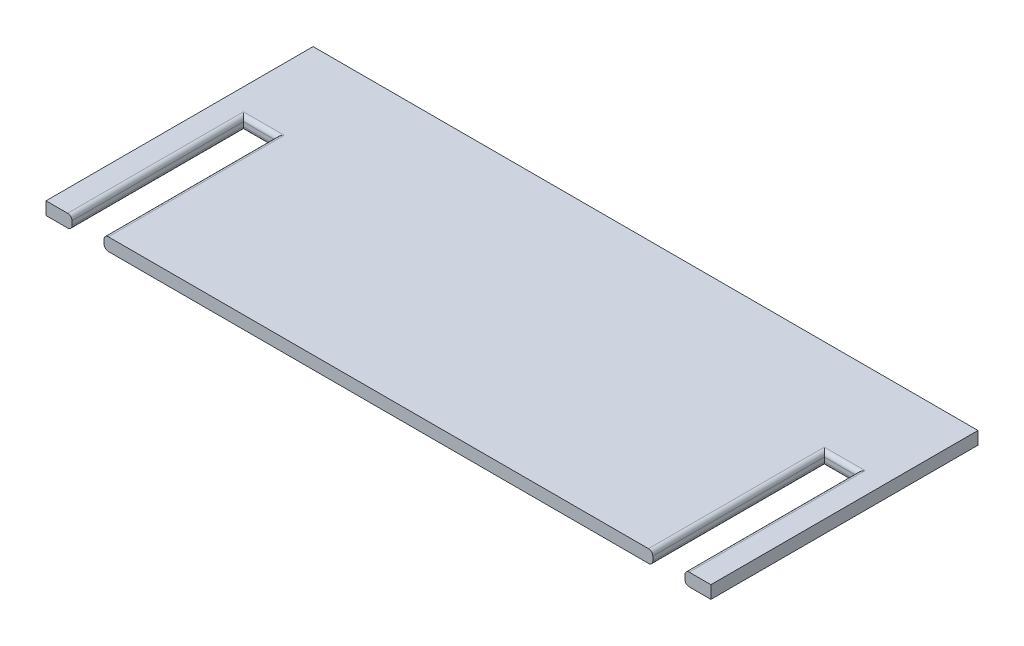
ISO-10303-21;
HEADER;
FILE_DESCRIPTION(('STEP AP214'),'2;1');
FILE_NAME('part.step','',(''),(''),'','','');
FILE_SCHEMA(('AUTOMOTIVE_DESIGN { 1 0 10303 214 1 1 1 1 }'));
ENDSEC;
DATA;
#1=APPLICATION_CONTEXT('core data for automotive mechanical design processes');
#2=APPLICATION_PROTOCOL_DEFINITION('international standard','automotive_design',2000,#1);
#3=PRODUCT_CONTEXT('',#1,'mechanical');
#4=PRODUCT('Part','Part','',(#3));
#5=PRODUCT_RELATED_PRODUCT_CATEGORY('part','',(#4));
#6=PRODUCT_DEFINITION_FORMATION('','',#4);
#7=PRODUCT_DEFINITION_CONTEXT('part definition',#1,'design');
#8=PRODUCT_DEFINITION('design','',#6,#7);
#9=PRODUCT_DEFINITION_SHAPE('','',#8);
#10=(LENGTH_UNIT() NAMED_UNIT(*) SI_UNIT(.MILLI.,.METRE.));
#11=(NAMED_UNIT(*) PLANE_ANGLE_UNIT() SI_UNIT($,.RADIAN.));
#12=(NAMED_UNIT(*) SI_UNIT($,.STERADIAN.) SOLID_ANGLE_UNIT());
#13=UNCERTAINTY_MEASURE_WITH_UNIT(LENGTH_MEASURE(1.E-05),#10,'distance_accuracy_value','');
#14=(GEOMETRIC_REPRESENTATION_CONTEXT(3) GLOBAL_UNCERTAINTY_ASSIGNED_CONTEXT((#13)) GLOBAL_UNIT_ASSIGNED_CONTEXT((#10,
#11,#12)) REPRESENTATION_CONTEXT('',''));
#15=CARTESIAN_POINT('',(0.,0.,0.));
#16=DIRECTION('',(0.,0.,1.));
#17=DIRECTION('',(1.,0.,0.));
#18=AXIS2_PLACEMENT_3D('',#15,#16,#17);
#19=CARTESIAN_POINT('',(155.03,1.49,31.14));
#20=DIRECTION('',(0.,0.,-1.));
#21=DIRECTION('',(-1.,0.,0.));
#22=AXIS2_PLACEMENT_3D('',#19,#20,#21);
#23=PLANE('',#22);
#24=DIRECTION('',(-1.,0.,0.));
#25=VECTOR('',#24,1.);
#26=CARTESIAN_POINT('',(155.03,-1.49,31.14));
#27=LINE('',#26,#25);
#28=CARTESIAN_POINT('',(140.484740143394,-1.49,31.14));
#29=VERTEX_POINT('',#28);
#30=CARTESIAN_POINT('',(14.5452598566057,-1.49,31.14));
#31=VERTEX_POINT('',#30);
#32=EDGE_CURVE('E206',#29,#31,#27,.T.);
#33=ORIENTED_EDGE('',*,*,#32,.F.);
#34=CARTESIAN_POINT('',(140.484740143394,-0.49,31.14));
#35=DIRECTION('',(0.,0.,-1.));
#36=DIRECTION('',(-1.,0.,0.));
#37=AXIS2_PLACEMENT_3D('',#34,#35,#36);
#38=CIRCLE('',#37,1.);
#39=CARTESIAN_POINT('',(141.484740143394,-0.49,31.14));
#40=VERTEX_POINT('',#39);
#41=EDGE_CURVE('E302',#29,#40,#38,.F.);
#42=ORIENTED_EDGE('',*,*,#41,.T.);
#43=DIRECTION('',(0.,1.,0.));
#44=VECTOR('',#43,1.);
#45=CARTESIAN_POINT('',(141.484740143394,-1.49,31.14));
#46=LINE('',#45,#44);
#47=CARTESIAN_POINT('',(141.484740143394,0.49,31.14));
#48=VERTEX_POINT('',#47);
#49=EDGE_CURVE('E249',#40,#48,#46,.T.);
#50=ORIENTED_EDGE('',*,*,#49,.T.);
#51=CARTESIAN_POINT('',(140.484740143394,0.49,31.14));
#52=DIRECTION('',(0.,0.,-1.));
#53=DIRECTION('',(-1.,0.,0.));
#54=AXIS2_PLACEMENT_3D('',#51,#52,#53);
#55=CIRCLE('',#54,1.);
#56=CARTESIAN_POINT('',(140.484740143394,1.49,31.14));
#57=VERTEX_POINT('',#56);
#58=EDGE_CURVE('E300',#48,#57,#55,.F.);
#59=ORIENTED_EDGE('',*,*,#58,.T.);
#60=DIRECTION('',(-1.,0.,0.));
#61=VECTOR('',#60,1.);
#62=CARTESIAN_POINT('',(155.03,1.49,31.14));
#63=LINE('',#62,#61);
#64=CARTESIAN_POINT('',(14.5452598566057,1.49,31.14));
#65=VERTEX_POINT('',#64);
#66=EDGE_CURVE('E223',#57,#65,#63,.T.);
#67=ORIENTED_EDGE('',*,*,#66,.T.);
#68=CARTESIAN_POINT('',(14.5452598566057,0.49,31.14));
#69=DIRECTION('',(0.,0.,-1.));
#70=DIRECTION('',(-1.,0.,0.));
#71=AXIS2_PLACEMENT_3D('',#68,#69,#70);
#72=CIRCLE('',#71,1.);
#73=CARTESIAN_POINT('',(13.5452598566057,0.49,31.14));
#74=VERTEX_POINT('',#73);
#75=EDGE_CURVE('E349',#65,#74,#72,.F.);
#76=ORIENTED_EDGE('',*,*,#75,.T.);
#77=DIRECTION('',(0.,1.,0.));
#78=VECTOR('',#77,1.);
#79=CARTESIAN_POINT('',(13.5452598566057,-1.49,31.14));
#80=LINE('',#79,#78);
#81=CARTESIAN_POINT('',(13.5452598566057,-0.49,31.14));
#82=VERTEX_POINT('',#81);
#83=EDGE_CURVE('E234',#82,#74,#80,.T.);
#84=ORIENTED_EDGE('',*,*,#83,.F.);
#85=CARTESIAN_POINT('',(14.5452598566057,-0.49,31.14));
#86=DIRECTION('',(0.,0.,-1.));
#87=DIRECTION('',(-1.,0.,0.));
#88=AXIS2_PLACEMENT_3D('',#85,#86,#87);
#89=CIRCLE('',#88,1.);
#90=EDGE_CURVE('E344',#82,#31,#89,.F.);
#91=ORIENTED_EDGE('',*,*,#90,.T.);
#92=EDGE_LOOP('',(#33,#42,#50,#59,#67,#76,#84,#91));
#93=FACE_BOUND('',#92,.T.);
#94=ADVANCED_FACE('F41',(#93),#23,.F.);
#95=DIRECTION('',(0.,1.,0.));
#96=VECTOR('',#95,1.);
#97=CARTESIAN_POINT('',(148.984740143394,-1.49,31.14));
#98=LINE('',#97,#96);
#99=CARTESIAN_POINT('',(148.984740143394,-0.49,31.14));
#100=VERTEX_POINT('',#99);
#101=CARTESIAN_POINT('',(148.984740143394,0.49,31.14));
#102=VERTEX_POINT('',#101);
#103=EDGE_CURVE('E252',#100,#102,#98,.T.);
#104=ORIENTED_EDGE('',*,*,#103,.F.);
#105=CARTESIAN_POINT('',(149.984740143394,-0.49,31.14));
#106=DIRECTION('',(0.,0.,-1.));
#107=DIRECTION('',(-1.,0.,0.));
#108=AXIS2_PLACEMENT_3D('',#105,#106,#107);
#109=CIRCLE('',#108,1.);
#110=CARTESIAN_POINT('',(149.984740143394,-1.49,31.14));
#111=VERTEX_POINT('',#110);
#112=EDGE_CURVE('E204',#100,#111,#109,.F.);
#113=ORIENTED_EDGE('',*,*,#112,.T.);
#114=CARTESIAN_POINT('',(155.03,-1.49,31.14));
#115=VERTEX_POINT('',#114);
#116=EDGE_CURVE('E184',#115,#111,#27,.T.);
#117=ORIENTED_EDGE('',*,*,#116,.F.);
#118=DIRECTION('',(0.,-1.,0.));
#119=VECTOR('',#118,1.);
#120=CARTESIAN_POINT('',(155.03,1.49,31.14));
#121=LINE('',#120,#119);
#122=CARTESIAN_POINT('',(155.03,1.49,31.14));
#123=VERTEX_POINT('',#122);
#124=EDGE_CURVE('E191',#123,#115,#121,.T.);
#125=ORIENTED_EDGE('',*,*,#124,.F.);
#126=CARTESIAN_POINT('',(149.984740143394,1.49,31.14));
#127=VERTEX_POINT('',#126);
#128=EDGE_CURVE('E219',#123,#127,#63,.T.);
#129=ORIENTED_EDGE('',*,*,#128,.T.);
#130=CARTESIAN_POINT('',(149.984740143394,0.49,31.14));
#131=DIRECTION('',(0.,0.,-1.));
#132=DIRECTION('',(-1.,0.,0.));
#133=AXIS2_PLACEMENT_3D('',#130,#131,#132);
#134=CIRCLE('',#133,1.);
#135=EDGE_CURVE('E283',#127,#102,#134,.F.);
#136=ORIENTED_EDGE('',*,*,#135,.T.);
#137=EDGE_LOOP('',(#104,#113,#117,#125,#129,#136));
#138=FACE_BOUND('',#137,.T.);
#139=ADVANCED_FACE('F203',(#138),#23,.F.);
#140=CARTESIAN_POINT('',(155.03,-1.49,31.14));
#141=DIRECTION('',(0.,1.,0.));
#142=DIRECTION('',(0.,0.,1.));
#143=AXIS2_PLACEMENT_3D('',#140,#141,#142);
#144=PLANE('',#143);
#145=ORIENTED_EDGE('',*,*,#116,.T.);
#146=DIRECTION('',(0.,0.,1.));
#147=VECTOR('',#146,1.);
#148=CARTESIAN_POINT('',(149.984740143394,-1.49,-8.86));
#149=LINE('',#148,#147);
#150=CARTESIAN_POINT('',(149.984740143394,-1.49,-9.86));
#151=VERTEX_POINT('',#150);
#152=EDGE_CURVE('E290',#111,#151,#149,.F.);
#153=ORIENTED_EDGE('',*,*,#152,.T.);
#154=DIRECTION('',(1.,0.,0.));
#155=VECTOR('',#154,1.);
#156=CARTESIAN_POINT('',(141.484740143394,-1.49,-9.86));
#157=LINE('',#156,#155);
#158=CARTESIAN_POINT('',(140.484740143394,-1.49,-9.86));
#159=VERTEX_POINT('',#158);
#160=EDGE_CURVE('E288',#151,#159,#157,.F.);
#161=ORIENTED_EDGE('',*,*,#160,.T.);
#162=DIRECTION('',(0.,0.,-1.));
#163=VECTOR('',#162,1.);
#164=CARTESIAN_POINT('',(140.484740143394,-1.49,31.14));
#165=LINE('',#164,#163);
#166=EDGE_CURVE('E286',#159,#29,#165,.F.);
#167=ORIENTED_EDGE('',*,*,#166,.T.);
#168=ORIENTED_EDGE('',*,*,#32,.T.);
#169=DIRECTION('',(0.,0.,-1.));
#170=VECTOR('',#169,1.);
#171=CARTESIAN_POINT('',(14.5452598566057,-1.49,31.14));
#172=LINE('',#171,#170);
#173=CARTESIAN_POINT('',(14.5452598566057,-1.49,-9.86));
#174=VERTEX_POINT('',#173);
#175=EDGE_CURVE('E205',#31,#174,#172,.T.);
#176=ORIENTED_EDGE('',*,*,#175,.T.);
#177=DIRECTION('',(-1.,0.,0.));
#178=VECTOR('',#177,1.);
#179=CARTESIAN_POINT('',(155.03,-1.49,-9.86));
#180=LINE('',#179,#178);
#181=CARTESIAN_POINT('',(5.04525985660567,-1.49,-9.86));
#182=VERTEX_POINT('',#181);
#183=EDGE_CURVE('E209',#174,#182,#180,.T.);
#184=ORIENTED_EDGE('',*,*,#183,.T.);
#185=DIRECTION('',(0.,0.,1.));
#186=VECTOR('',#185,1.);
#187=CARTESIAN_POINT('',(5.04525985660567,-1.49,31.14));
#188=LINE('',#187,#186);
#189=CARTESIAN_POINT('',(5.04525985660567,-1.49,31.14));
#190=VERTEX_POINT('',#189);
#191=EDGE_CURVE('E357',#182,#190,#188,.T.);
#192=ORIENTED_EDGE('',*,*,#191,.T.);
#193=CARTESIAN_POINT('',(0.,-1.49,31.14));
#194=VERTEX_POINT('',#193);
#195=EDGE_CURVE('E208',#190,#194,#27,.T.);
#196=ORIENTED_EDGE('',*,*,#195,.T.);
#197=DIRECTION('',(0.,0.,-1.));
#198=VECTOR('',#197,1.);
#199=CARTESIAN_POINT('',(0.,-1.49,31.14));
#200=LINE('',#199,#198);
#201=CARTESIAN_POINT('',(0.,-1.49,-31.14));
#202=VERTEX_POINT('',#201);
#203=EDGE_CURVE('E229',#194,#202,#200,.T.);
#204=ORIENTED_EDGE('',*,*,#203,.T.);
#205=DIRECTION('',(-1.,0.,0.));
#206=VECTOR('',#205,1.);
#207=CARTESIAN_POINT('',(155.03,-1.49,-31.14));
#208=LINE('',#207,#206);
#209=CARTESIAN_POINT('',(155.03,-1.49,-31.14));
#210=VERTEX_POINT('',#209);
#211=EDGE_CURVE('E187',#210,#202,#208,.T.);
#212=ORIENTED_EDGE('',*,*,#211,.F.);
#213=DIRECTION('',(0.,0.,-1.));
#214=VECTOR('',#213,1.);
#215=CARTESIAN_POINT('',(155.03,-1.49,31.14));
#216=LINE('',#215,#214);
#217=EDGE_CURVE('E180',#115,#210,#216,.T.);
#218=ORIENTED_EDGE('',*,*,#217,.F.);
#219=EDGE_LOOP('',(#145,#153,#161,#167,#168,#176,#184,#192,#196,#204,#212,#218));
#220=FACE_BOUND('',#219,.T.);
#221=ADVANCED_FACE('F182',(#220),#144,.F.);
#222=CARTESIAN_POINT('',(155.03,1.49,31.14));
#223=DIRECTION('',(0.,-1.,0.));
#224=DIRECTION('',(0.,0.,-1.));
#225=AXIS2_PLACEMENT_3D('',#222,#223,#224);
#226=PLANE('',#225);
#227=ORIENTED_EDGE('',*,*,#66,.F.);
#228=DIRECTION('',(0.,0.,-1.));
#229=VECTOR('',#228,1.);
#230=CARTESIAN_POINT('',(140.484740143394,1.49,-8.86));
#231=LINE('',#230,#229);
#232=CARTESIAN_POINT('',(140.484740143394,1.49,-9.86));
#233=VERTEX_POINT('',#232);
#234=EDGE_CURVE('E11',#57,#233,#231,.T.);
#235=ORIENTED_EDGE('',*,*,#234,.T.);
#236=DIRECTION('',(1.,0.,0.));
#237=VECTOR('',#236,1.);
#238=CARTESIAN_POINT('',(148.984740143394,1.49,-9.86));
#239=LINE('',#238,#237);
#240=CARTESIAN_POINT('',(149.984740143394,1.49,-9.86));
#241=VERTEX_POINT('',#240);
#242=EDGE_CURVE('E50',#233,#241,#239,.T.);
#243=ORIENTED_EDGE('',*,*,#242,.T.);
#244=DIRECTION('',(0.,0.,1.));
#245=VECTOR('',#244,1.);
#246=CARTESIAN_POINT('',(149.984740143394,1.49,31.14));
#247=LINE('',#246,#245);
#248=EDGE_CURVE('E304',#241,#127,#247,.T.);
#249=ORIENTED_EDGE('',*,*,#248,.T.);
#250=ORIENTED_EDGE('',*,*,#128,.F.);
#251=DIRECTION('',(0.,0.,1.));
#252=VECTOR('',#251,1.);
#253=CARTESIAN_POINT('',(155.03,1.49,31.14));
#254=LINE('',#253,#252);
#255=CARTESIAN_POINT('',(155.03,1.49,-31.14));
#256=VERTEX_POINT('',#255);
#257=EDGE_CURVE('E196',#256,#123,#254,.T.);
#258=ORIENTED_EDGE('',*,*,#257,.F.);
#259=DIRECTION('',(-1.,0.,0.));
#260=VECTOR('',#259,1.);
#261=CARTESIAN_POINT('',(155.03,1.49,-31.14));
#262=LINE('',#261,#260);
#263=CARTESIAN_POINT('',(0.,1.49,-31.14));
#264=VERTEX_POINT('',#263);
#265=EDGE_CURVE('E215',#256,#264,#262,.T.);
#266=ORIENTED_EDGE('',*,*,#265,.T.);
#267=DIRECTION('',(0.,0.,1.));
#268=VECTOR('',#267,1.);
#269=CARTESIAN_POINT('',(0.,1.49,31.14));
#270=LINE('',#269,#268);
#271=CARTESIAN_POINT('',(0.,1.49,31.14));
#272=VERTEX_POINT('',#271);
#273=EDGE_CURVE('E200',#264,#272,#270,.T.);
#274=ORIENTED_EDGE('',*,*,#273,.T.);
#275=CARTESIAN_POINT('',(5.04525985660567,1.49,31.14));
#276=VERTEX_POINT('',#275);
#277=EDGE_CURVE('E224',#276,#272,#63,.T.);
#278=ORIENTED_EDGE('',*,*,#277,.F.);
#279=DIRECTION('',(0.,0.,1.));
#280=VECTOR('',#279,1.);
#281=CARTESIAN_POINT('',(5.04525985660567,1.49,31.14));
#282=LINE('',#281,#280);
#283=CARTESIAN_POINT('',(5.04525985660568,1.49,-9.86));
#284=VERTEX_POINT('',#283);
#285=EDGE_CURVE('E348',#276,#284,#282,.F.);
#286=ORIENTED_EDGE('',*,*,#285,.T.);
#287=DIRECTION('',(-1.,0.,0.));
#288=VECTOR('',#287,1.);
#289=CARTESIAN_POINT('',(155.03,1.49,-9.86));
#290=LINE('',#289,#288);
#291=CARTESIAN_POINT('',(14.5452598566057,1.49,-9.86));
#292=VERTEX_POINT('',#291);
#293=EDGE_CURVE('E387',#284,#292,#290,.F.);
#294=ORIENTED_EDGE('',*,*,#293,.T.);
#295=DIRECTION('',(0.,0.,-1.));
#296=VECTOR('',#295,1.);
#297=CARTESIAN_POINT('',(14.5452598566057,1.49,31.14));
#298=LINE('',#297,#296);
#299=EDGE_CURVE('E280',#292,#65,#298,.F.);
#300=ORIENTED_EDGE('',*,*,#299,.T.);
#301=EDGE_LOOP('',(#227,#235,#243,#249,#250,#258,#266,#274,#278,#286,#294,#300));
#302=FACE_BOUND('',#301,.T.);
#303=ADVANCED_FACE('F320',(#302),#226,.F.);
#304=ORIENTED_EDGE('',*,*,#195,.F.);
#305=CARTESIAN_POINT('',(5.04525985660567,-0.49,31.14));
#306=DIRECTION('',(0.,0.,-1.));
#307=DIRECTION('',(-1.,0.,0.));
#308=AXIS2_PLACEMENT_3D('',#305,#306,#307);
#309=CIRCLE('',#308,1.);
#310=CARTESIAN_POINT('',(6.04525985660568,-0.49,31.14));
#311=VERTEX_POINT('',#310);
#312=EDGE_CURVE('E367',#190,#311,#309,.F.);
#313=ORIENTED_EDGE('',*,*,#312,.T.);
#314=DIRECTION('',(0.,1.,0.));
#315=VECTOR('',#314,1.);
#316=CARTESIAN_POINT('',(6.04525985660568,-1.49,31.14));
#317=LINE('',#316,#315);
#318=CARTESIAN_POINT('',(6.04525985660568,0.49,31.14));
#319=VERTEX_POINT('',#318);
#320=EDGE_CURVE('E244',#311,#319,#317,.T.);
#321=ORIENTED_EDGE('',*,*,#320,.T.);
#322=CARTESIAN_POINT('',(5.04525985660568,0.49,31.14));
#323=DIRECTION('',(0.,0.,-1.));
#324=DIRECTION('',(-1.,0.,0.));
#325=AXIS2_PLACEMENT_3D('',#322,#323,#324);
#326=CIRCLE('',#325,1.);
#327=EDGE_CURVE('E368',#319,#276,#326,.F.);
#328=ORIENTED_EDGE('',*,*,#327,.T.);
#329=ORIENTED_EDGE('',*,*,#277,.T.);
#330=DIRECTION('',(0.,-1.,0.));
#331=VECTOR('',#330,1.);
#332=CARTESIAN_POINT('',(0.,1.49,31.14));
#333=LINE('',#332,#331);
#334=EDGE_CURVE('E231',#272,#194,#333,.T.);
#335=ORIENTED_EDGE('',*,*,#334,.T.);
#336=EDGE_LOOP('',(#304,#313,#321,#328,#329,#335));
#337=FACE_BOUND('',#336,.T.);
#338=ADVANCED_FACE('F421',(#337),#23,.F.);
#339=CARTESIAN_POINT('',(155.03,1.49,-31.14));
#340=DIRECTION('',(0.,0.,1.));
#341=DIRECTION('',(1.,0.,0.));
#342=AXIS2_PLACEMENT_3D('',#339,#340,#341);
#343=PLANE('',#342);
#344=DIRECTION('',(0.,1.,0.));
#345=VECTOR('',#344,1.);
#346=CARTESIAN_POINT('',(0.,1.49,-31.14));
#347=LINE('',#346,#345);
#348=EDGE_CURVE('E227',#202,#264,#347,.T.);
#349=ORIENTED_EDGE('',*,*,#348,.T.);
#350=ORIENTED_EDGE('',*,*,#265,.F.);
#351=DIRECTION('',(0.,1.,0.));
#352=VECTOR('',#351,1.);
#353=CARTESIAN_POINT('',(155.03,1.49,-31.14));
#354=LINE('',#353,#352);
#355=EDGE_CURVE('E190',#210,#256,#354,.T.);
#356=ORIENTED_EDGE('',*,*,#355,.F.);
#357=ORIENTED_EDGE('',*,*,#211,.T.);
#358=EDGE_LOOP('',(#349,#350,#356,#357));
#359=FACE_BOUND('',#358,.T.);
#360=ADVANCED_FACE('F428',(#359),#343,.F.);
#361=CARTESIAN_POINT('',(155.03,0.,0.));
#362=DIRECTION('',(1.,0.,0.));
#363=DIRECTION('',(0.,0.,-1.));
#364=AXIS2_PLACEMENT_3D('',#361,#362,#363);
#365=PLANE('',#364);
#366=ORIENTED_EDGE('',*,*,#124,.T.);
#367=ORIENTED_EDGE('',*,*,#217,.T.);
#368=ORIENTED_EDGE('',*,*,#355,.T.);
#369=ORIENTED_EDGE('',*,*,#257,.T.);
#370=EDGE_LOOP('',(#366,#367,#368,#369));
#371=FACE_BOUND('',#370,.T.);
#372=ADVANCED_FACE('F194',(#371),#365,.T.);
#373=CARTESIAN_POINT('',(0.,0.,0.));
#374=DIRECTION('',(1.,0.,0.));
#375=DIRECTION('',(0.,0.,-1.));
#376=AXIS2_PLACEMENT_3D('',#373,#374,#375);
#377=PLANE('',#376);
#378=ORIENTED_EDGE('',*,*,#334,.F.);
#379=ORIENTED_EDGE('',*,*,#273,.F.);
#380=ORIENTED_EDGE('',*,*,#348,.F.);
#381=ORIENTED_EDGE('',*,*,#203,.F.);
#382=EDGE_LOOP('',(#378,#379,#380,#381));
#383=FACE_BOUND('',#382,.T.);
#384=ADVANCED_FACE('F442',(#383),#377,.F.);
#385=CARTESIAN_POINT('',(13.5452598566057,-1.49,31.14));
#386=DIRECTION('',(1.,0.,0.));
#387=DIRECTION('',(0.,0.,-1.));
#388=AXIS2_PLACEMENT_3D('',#385,#386,#387);
#389=PLANE('',#388);
#390=DIRECTION('',(0.,1.,0.));
#391=VECTOR('',#390,1.);
#392=CARTESIAN_POINT('',(13.5452598566057,-1.49,-8.86));
#393=LINE('',#392,#391);
#394=CARTESIAN_POINT('',(13.5452598566057,-0.489999999999997,-8.86));
#395=VERTEX_POINT('',#394);
#396=CARTESIAN_POINT('',(13.5452598566057,0.489999999999997,-8.86));
#397=VERTEX_POINT('',#396);
#398=EDGE_CURVE('E237',#395,#397,#393,.T.);
#399=ORIENTED_EDGE('',*,*,#398,.F.);
#400=DIRECTION('',(0.,0.,-1.));
#401=VECTOR('',#400,1.);
#402=CARTESIAN_POINT('',(13.5452598566057,-0.49,31.14));
#403=LINE('',#402,#401);
#404=EDGE_CURVE('E383',#395,#82,#403,.F.);
#405=ORIENTED_EDGE('',*,*,#404,.T.);
#406=ORIENTED_EDGE('',*,*,#83,.T.);
#407=DIRECTION('',(0.,0.,-1.));
#408=VECTOR('',#407,1.);
#409=CARTESIAN_POINT('',(13.5452598566057,0.49,31.14));
#410=LINE('',#409,#408);
#411=EDGE_CURVE('E380',#74,#397,#410,.T.);
#412=ORIENTED_EDGE('',*,*,#411,.T.);
#413=EDGE_LOOP('',(#399,#405,#406,#412));
#414=FACE_BOUND('',#413,.T.);
#415=ADVANCED_FACE('F395',(#414),#389,.F.);
#416=CARTESIAN_POINT('',(6.04525985660568,-1.49,31.14));
#417=DIRECTION('',(-1.,0.,0.));
#418=DIRECTION('',(0.,0.,1.));
#419=AXIS2_PLACEMENT_3D('',#416,#417,#418);
#420=PLANE('',#419);
#421=ORIENTED_EDGE('',*,*,#320,.F.);
#422=DIRECTION('',(0.,0.,1.));
#423=VECTOR('',#422,1.);
#424=CARTESIAN_POINT('',(6.04525985660568,-0.49,31.14));
#425=LINE('',#424,#423);
#426=CARTESIAN_POINT('',(6.04525985660568,-0.489999999999997,-8.86));
#427=VERTEX_POINT('',#426);
#428=EDGE_CURVE('E375',#311,#427,#425,.F.);
#429=ORIENTED_EDGE('',*,*,#428,.T.);
#430=DIRECTION('',(0.,1.,0.));
#431=VECTOR('',#430,1.);
#432=CARTESIAN_POINT('',(6.04525985660568,-1.49,-8.86));
#433=LINE('',#432,#431);
#434=CARTESIAN_POINT('',(6.04525985660568,0.489999999999997,-8.86));
#435=VERTEX_POINT('',#434);
#436=EDGE_CURVE('E240',#427,#435,#433,.T.);
#437=ORIENTED_EDGE('',*,*,#436,.T.);
#438=DIRECTION('',(0.,0.,1.));
#439=VECTOR('',#438,1.);
#440=CARTESIAN_POINT('',(6.04525985660568,0.49,31.14));
#441=LINE('',#440,#439);
#442=EDGE_CURVE('E373',#435,#319,#441,.T.);
#443=ORIENTED_EDGE('',*,*,#442,.T.);
#444=EDGE_LOOP('',(#421,#429,#437,#443));
#445=FACE_BOUND('',#444,.T.);
#446=ADVANCED_FACE('F402',(#445),#420,.F.);
#447=CARTESIAN_POINT('',(6.04525985660568,-1.49,-8.86));
#448=DIRECTION('',(0.,0.,-1.));
#449=DIRECTION('',(0.,1.,0.));
#450=AXIS2_PLACEMENT_3D('',#447,#448,#449);
#451=PLANE('',#450);
#452=ORIENTED_EDGE('',*,*,#436,.F.);
#453=DIRECTION('',(-1.,0.,0.));
#454=VECTOR('',#453,1.);
#455=CARTESIAN_POINT('',(6.04525985660568,-0.489999999999997,-8.86));
#456=LINE('',#455,#454);
#457=EDGE_CURVE('E363',#427,#395,#456,.F.);
#458=ORIENTED_EDGE('',*,*,#457,.T.);
#459=ORIENTED_EDGE('',*,*,#398,.T.);
#460=DIRECTION('',(-1.,0.,0.));
#461=VECTOR('',#460,1.);
#462=CARTESIAN_POINT('',(6.04525985660568,0.489999999999997,-8.86));
#463=LINE('',#462,#461);
#464=EDGE_CURVE('E377',#397,#435,#463,.T.);
#465=ORIENTED_EDGE('',*,*,#464,.T.);
#466=EDGE_LOOP('',(#452,#458,#459,#465));
#467=FACE_BOUND('',#466,.T.);
#468=ADVANCED_FACE('F398',(#467),#451,.F.);
#469=CARTESIAN_POINT('',(14.5452598566057,-0.49,31.14));
#470=DIRECTION('',(0.,0.,-1.));
#471=DIRECTION('',(0.,1.,0.));
#472=AXIS2_PLACEMENT_3D('',#469,#470,#471);
#473=CYLINDRICAL_SURFACE('',#472,1.);
#474=ORIENTED_EDGE('',*,*,#90,.F.);
#475=ORIENTED_EDGE('',*,*,#404,.F.);
#476=CARTESIAN_POINT('',(14.5452598566057,-0.489999999999997,-9.86));
#477=DIRECTION('',(-0.707106781186547,0.,-0.707106781186547));
#478=DIRECTION('',(-0.707106781186547,0.,0.707106781186547));
#479=AXIS2_PLACEMENT_3D('',#476,#477,#478);
#480=ELLIPSE('',#479,1.41421356237309,1.);
#481=EDGE_CURVE('E241',#174,#395,#480,.T.);
#482=ORIENTED_EDGE('',*,*,#481,.F.);
#483=ORIENTED_EDGE('',*,*,#175,.F.);
#484=EDGE_LOOP('',(#474,#475,#482,#483));
#485=FACE_BOUND('',#484,.T.);
#486=ADVANCED_FACE('F352',(#485),#473,.T.);
#487=CARTESIAN_POINT('',(155.03,-0.489999999999997,-9.86));
#488=DIRECTION('',(-1.,0.,0.));
#489=DIRECTION('',(0.,0.,1.));
#490=AXIS2_PLACEMENT_3D('',#487,#488,#489);
#491=CYLINDRICAL_SURFACE('',#490,1.);
#492=ORIENTED_EDGE('',*,*,#481,.T.);
#493=ORIENTED_EDGE('',*,*,#457,.F.);
#494=CARTESIAN_POINT('',(5.04525985660567,-0.489999999999997,-9.86));
#495=DIRECTION('',(-0.707106781186547,0.,0.707106781186547));
#496=DIRECTION('',(0.707106781186547,0.,0.707106781186547));
#497=AXIS2_PLACEMENT_3D('',#494,#495,#496);
#498=ELLIPSE('',#497,1.41421356237309,1.);
#499=EDGE_CURVE('E272',#182,#427,#498,.T.);
#500=ORIENTED_EDGE('',*,*,#499,.F.);
#501=ORIENTED_EDGE('',*,*,#183,.F.);
#502=EDGE_LOOP('',(#492,#493,#500,#501));
#503=FACE_BOUND('',#502,.T.);
#504=ADVANCED_FACE('F362',(#503),#491,.T.);
#505=CARTESIAN_POINT('',(5.04525985660567,-0.49,31.14));
#506=DIRECTION('',(0.,0.,1.));
#507=DIRECTION('',(0.,-1.,0.));
#508=AXIS2_PLACEMENT_3D('',#505,#506,#507);
#509=CYLINDRICAL_SURFACE('',#508,1.);
#510=ORIENTED_EDGE('',*,*,#499,.T.);
#511=ORIENTED_EDGE('',*,*,#428,.F.);
#512=ORIENTED_EDGE('',*,*,#312,.F.);
#513=ORIENTED_EDGE('',*,*,#191,.F.);
#514=EDGE_LOOP('',(#510,#511,#512,#513));
#515=FACE_BOUND('',#514,.T.);
#516=ADVANCED_FACE('F366',(#515),#509,.T.);
#517=CARTESIAN_POINT('',(5.04525985660568,0.49,31.14));
#518=DIRECTION('',(0.,0.,1.));
#519=DIRECTION('',(0.,-1.,0.));
#520=AXIS2_PLACEMENT_3D('',#517,#518,#519);
#521=CYLINDRICAL_SURFACE('',#520,1.);
#522=ORIENTED_EDGE('',*,*,#327,.F.);
#523=ORIENTED_EDGE('',*,*,#442,.F.);
#524=CARTESIAN_POINT('',(5.04525985660568,0.489999999999997,-9.86));
#525=DIRECTION('',(-0.707106781186547,0.,0.707106781186547));
#526=DIRECTION('',(-0.707106781186547,0.,-0.707106781186547));
#527=AXIS2_PLACEMENT_3D('',#524,#525,#526);
#528=ELLIPSE('',#527,1.41421356237309,1.);
#529=EDGE_CURVE('E264',#284,#435,#528,.F.);
#530=ORIENTED_EDGE('',*,*,#529,.F.);
#531=ORIENTED_EDGE('',*,*,#285,.F.);
#532=EDGE_LOOP('',(#522,#523,#530,#531));
#533=FACE_BOUND('',#532,.T.);
#534=ADVANCED_FACE('F406',(#533),#521,.T.);
#535=CARTESIAN_POINT('',(6.04525985660568,0.489999999999997,-9.86));
#536=DIRECTION('',(-1.,0.,0.));
#537=DIRECTION('',(0.,0.,1.));
#538=AXIS2_PLACEMENT_3D('',#535,#536,#537);
#539=CYLINDRICAL_SURFACE('',#538,1.);
#540=ORIENTED_EDGE('',*,*,#529,.T.);
#541=ORIENTED_EDGE('',*,*,#464,.F.);
#542=CARTESIAN_POINT('',(14.5452598566057,0.489999999999997,-9.86));
#543=DIRECTION('',(-0.707106781186547,0.,-0.707106781186547));
#544=DIRECTION('',(0.707106781186547,0.,-0.707106781186547));
#545=AXIS2_PLACEMENT_3D('',#542,#543,#544);
#546=ELLIPSE('',#545,1.41421356237309,1.);
#547=EDGE_CURVE('E261',#292,#397,#546,.F.);
#548=ORIENTED_EDGE('',*,*,#547,.F.);
#549=ORIENTED_EDGE('',*,*,#293,.F.);
#550=EDGE_LOOP('',(#540,#541,#548,#549));
#551=FACE_BOUND('',#550,.T.);
#552=ADVANCED_FACE('F409',(#551),#539,.T.);
#553=CARTESIAN_POINT('',(14.5452598566057,0.49,31.14));
#554=DIRECTION('',(0.,0.,-1.));
#555=DIRECTION('',(0.,1.,0.));
#556=AXIS2_PLACEMENT_3D('',#553,#554,#555);
#557=CYLINDRICAL_SURFACE('',#556,1.);
#558=ORIENTED_EDGE('',*,*,#75,.F.);
#559=ORIENTED_EDGE('',*,*,#299,.F.);
#560=ORIENTED_EDGE('',*,*,#547,.T.);
#561=ORIENTED_EDGE('',*,*,#411,.F.);
#562=EDGE_LOOP('',(#558,#559,#560,#561));
#563=FACE_BOUND('',#562,.T.);
#564=ADVANCED_FACE('F392',(#563),#557,.T.);
#565=CARTESIAN_POINT('',(141.484740143394,-1.49,31.14));
#566=DIRECTION('',(1.,0.,0.));
#567=DIRECTION('',(0.,0.,-1.));
#568=AXIS2_PLACEMENT_3D('',#565,#566,#567);
#569=PLANE('',#568);
#570=ORIENTED_EDGE('',*,*,#49,.F.);
#571=DIRECTION('',(0.,0.,-1.));
#572=VECTOR('',#571,1.);
#573=CARTESIAN_POINT('',(141.484740143394,-0.489999999999997,-8.86));
#574=LINE('',#573,#572);
#575=CARTESIAN_POINT('',(141.484740143394,-0.489999999999997,-8.86));
#576=VERTEX_POINT('',#575);
#577=EDGE_CURVE('E298',#40,#576,#574,.T.);
#578=ORIENTED_EDGE('',*,*,#577,.T.);
#579=DIRECTION('',(0.,1.,0.));
#580=VECTOR('',#579,1.);
#581=CARTESIAN_POINT('',(141.484740143394,-1.49,-8.86));
#582=LINE('',#581,#580);
#583=CARTESIAN_POINT('',(141.484740143394,0.489999999999997,-8.86));
#584=VERTEX_POINT('',#583);
#585=EDGE_CURVE('E259',#576,#584,#582,.T.);
#586=ORIENTED_EDGE('',*,*,#585,.T.);
#587=DIRECTION('',(0.,0.,-1.));
#588=VECTOR('',#587,1.);
#589=CARTESIAN_POINT('',(141.484740143394,0.49,31.14));
#590=LINE('',#589,#588);
#591=EDGE_CURVE('E296',#584,#48,#590,.F.);
#592=ORIENTED_EDGE('',*,*,#591,.T.);
#593=EDGE_LOOP('',(#570,#578,#586,#592));
#594=FACE_BOUND('',#593,.T.);
#595=ADVANCED_FACE('F416',(#594),#569,.T.);
#596=CARTESIAN_POINT('',(148.984740143394,-1.49,-8.86));
#597=DIRECTION('',(0.,0.,1.));
#598=DIRECTION('',(0.,-1.,0.));
#599=AXIS2_PLACEMENT_3D('',#596,#597,#598);
#600=PLANE('',#599);
#601=ORIENTED_EDGE('',*,*,#585,.F.);
#602=DIRECTION('',(1.,0.,0.));
#603=VECTOR('',#602,1.);
#604=CARTESIAN_POINT('',(148.984740143394,-0.489999999999997,-8.86));
#605=LINE('',#604,#603);
#606=CARTESIAN_POINT('',(148.984740143394,-0.489999999999997,-8.86));
#607=VERTEX_POINT('',#606);
#608=EDGE_CURVE('E294',#576,#607,#605,.T.);
#609=ORIENTED_EDGE('',*,*,#608,.T.);
#610=DIRECTION('',(0.,1.,0.));
#611=VECTOR('',#610,1.);
#612=CARTESIAN_POINT('',(148.984740143394,-1.49,-8.86));
#613=LINE('',#612,#611);
#614=CARTESIAN_POINT('',(148.984740143394,0.489999999999997,-8.86));
#615=VERTEX_POINT('',#614);
#616=EDGE_CURVE('E256',#607,#615,#613,.T.);
#617=ORIENTED_EDGE('',*,*,#616,.T.);
#618=DIRECTION('',(1.,0.,0.));
#619=VECTOR('',#618,1.);
#620=CARTESIAN_POINT('',(141.484740143394,0.489999999999997,-8.86));
#621=LINE('',#620,#619);
#622=EDGE_CURVE('E292',#615,#584,#621,.F.);
#623=ORIENTED_EDGE('',*,*,#622,.T.);
#624=EDGE_LOOP('',(#601,#609,#617,#623));
#625=FACE_BOUND('',#624,.T.);
#626=ADVANCED_FACE('F467',(#625),#600,.T.);
#627=CARTESIAN_POINT('',(148.984740143394,-1.49,31.14));
#628=DIRECTION('',(-1.,0.,0.));
#629=DIRECTION('',(0.,0.,1.));
#630=AXIS2_PLACEMENT_3D('',#627,#628,#629);
#631=PLANE('',#630);
#632=ORIENTED_EDGE('',*,*,#616,.F.);
#633=DIRECTION('',(0.,0.,1.));
#634=VECTOR('',#633,1.);
#635=CARTESIAN_POINT('',(148.984740143394,-0.49,31.14));
#636=LINE('',#635,#634);
#637=EDGE_CURVE('E279',#607,#100,#636,.T.);
#638=ORIENTED_EDGE('',*,*,#637,.T.);
#639=ORIENTED_EDGE('',*,*,#103,.T.);
#640=DIRECTION('',(0.,0.,1.));
#641=VECTOR('',#640,1.);
#642=CARTESIAN_POINT('',(148.984740143394,0.489999999999997,-8.86));
#643=LINE('',#642,#641);
#644=EDGE_CURVE('E277',#102,#615,#643,.F.);
#645=ORIENTED_EDGE('',*,*,#644,.T.);
#646=EDGE_LOOP('',(#632,#638,#639,#645));
#647=FACE_BOUND('',#646,.T.);
#648=ADVANCED_FACE('F323',(#647),#631,.T.);
#649=CARTESIAN_POINT('',(140.484740143394,-0.49,31.14));
#650=DIRECTION('',(0.,0.,1.));
#651=DIRECTION('',(0.,-1.,0.));
#652=AXIS2_PLACEMENT_3D('',#649,#650,#651);
#653=CYLINDRICAL_SURFACE('',#652,1.);
#654=ORIENTED_EDGE('',*,*,#41,.F.);
#655=ORIENTED_EDGE('',*,*,#166,.F.);
#656=CARTESIAN_POINT('',(140.484740143394,-0.489999999999997,-9.86));
#657=DIRECTION('',(-0.707106781186547,0.,0.707106781186547));
#658=DIRECTION('',(-0.707106781186547,0.,-0.707106781186547));
#659=AXIS2_PLACEMENT_3D('',#656,#657,#658);
#660=ELLIPSE('',#659,1.41421356237309,1.);
#661=EDGE_CURVE('E253',#576,#159,#660,.F.);
#662=ORIENTED_EDGE('',*,*,#661,.F.);
#663=ORIENTED_EDGE('',*,*,#577,.F.);
#664=EDGE_LOOP('',(#654,#655,#662,#663));
#665=FACE_BOUND('',#664,.T.);
#666=ADVANCED_FACE('F337',(#665),#653,.T.);
#667=CARTESIAN_POINT('',(148.984740143394,-0.489999999999997,-9.86));
#668=DIRECTION('',(-1.,0.,0.));
#669=DIRECTION('',(0.,0.,1.));
#670=AXIS2_PLACEMENT_3D('',#667,#668,#669);
#671=CYLINDRICAL_SURFACE('',#670,1.);
#672=ORIENTED_EDGE('',*,*,#661,.T.);
#673=ORIENTED_EDGE('',*,*,#160,.F.);
#674=CARTESIAN_POINT('',(149.984740143394,-0.489999999999997,-9.86));
#675=DIRECTION('',(-0.707106781186547,0.,-0.707106781186547));
#676=DIRECTION('',(0.707106781186547,0.,-0.707106781186547));
#677=AXIS2_PLACEMENT_3D('',#674,#675,#676);
#678=ELLIPSE('',#677,1.41421356237309,1.);
#679=EDGE_CURVE('E307',#607,#151,#678,.F.);
#680=ORIENTED_EDGE('',*,*,#679,.F.);
#681=ORIENTED_EDGE('',*,*,#608,.F.);
#682=EDGE_LOOP('',(#672,#673,#680,#681));
#683=FACE_BOUND('',#682,.T.);
#684=ADVANCED_FACE('F331',(#683),#671,.T.);
#685=CARTESIAN_POINT('',(149.984740143394,-0.49,31.14));
#686=DIRECTION('',(0.,0.,-1.));
#687=DIRECTION('',(0.,1.,0.));
#688=AXIS2_PLACEMENT_3D('',#685,#686,#687);
#689=CYLINDRICAL_SURFACE('',#688,1.);
#690=ORIENTED_EDGE('',*,*,#679,.T.);
#691=ORIENTED_EDGE('',*,*,#152,.F.);
#692=ORIENTED_EDGE('',*,*,#112,.F.);
#693=ORIENTED_EDGE('',*,*,#637,.F.);
#694=EDGE_LOOP('',(#690,#691,#692,#693));
#695=FACE_BOUND('',#694,.T.);
#696=ADVANCED_FACE('F327',(#695),#689,.T.);
#697=CARTESIAN_POINT('',(149.984740143394,0.49,31.14));
#698=DIRECTION('',(0.,0.,-1.));
#699=DIRECTION('',(0.,1.,0.));
#700=AXIS2_PLACEMENT_3D('',#697,#698,#699);
#701=CYLINDRICAL_SURFACE('',#700,1.);
#702=ORIENTED_EDGE('',*,*,#135,.F.);
#703=ORIENTED_EDGE('',*,*,#248,.F.);
#704=CARTESIAN_POINT('',(149.984740143394,0.489999999999997,-9.86));
#705=DIRECTION('',(-0.707106781186547,0.,-0.707106781186547));
#706=DIRECTION('',(-0.707106781186547,0.,0.707106781186547));
#707=AXIS2_PLACEMENT_3D('',#704,#705,#706);
#708=ELLIPSE('',#707,1.41421356237309,1.);
#709=EDGE_CURVE('E45',#615,#241,#708,.T.);
#710=ORIENTED_EDGE('',*,*,#709,.F.);
#711=ORIENTED_EDGE('',*,*,#644,.F.);
#712=EDGE_LOOP('',(#702,#703,#710,#711));
#713=FACE_BOUND('',#712,.T.);
#714=ADVANCED_FACE('F43',(#713),#701,.T.);
#715=CARTESIAN_POINT('',(155.03,0.489999999999997,-9.86));
#716=DIRECTION('',(-1.,0.,0.));
#717=DIRECTION('',(0.,0.,1.));
#718=AXIS2_PLACEMENT_3D('',#715,#716,#717);
#719=CYLINDRICAL_SURFACE('',#718,1.);
#720=ORIENTED_EDGE('',*,*,#709,.T.);
#721=ORIENTED_EDGE('',*,*,#242,.F.);
#722=CARTESIAN_POINT('',(140.484740143394,0.489999999999997,-9.86));
#723=DIRECTION('',(-0.707106781186547,0.,0.707106781186547));
#724=DIRECTION('',(0.707106781186547,0.,0.707106781186547));
#725=AXIS2_PLACEMENT_3D('',#722,#723,#724);
#726=ELLIPSE('',#725,1.41421356237309,1.);
#727=EDGE_CURVE('E58',#584,#233,#726,.T.);
#728=ORIENTED_EDGE('',*,*,#727,.F.);
#729=ORIENTED_EDGE('',*,*,#622,.F.);
#730=EDGE_LOOP('',(#720,#721,#728,#729));
#731=FACE_BOUND('',#730,.T.);
#732=ADVANCED_FACE('F315',(#731),#719,.T.);
#733=CARTESIAN_POINT('',(140.484740143394,0.49,31.14));
#734=DIRECTION('',(0.,0.,1.));
#735=DIRECTION('',(0.,-1.,0.));
#736=AXIS2_PLACEMENT_3D('',#733,#734,#735);
#737=CYLINDRICAL_SURFACE('',#736,1.);
#738=ORIENTED_EDGE('',*,*,#58,.F.);
#739=ORIENTED_EDGE('',*,*,#591,.F.);
#740=ORIENTED_EDGE('',*,*,#727,.T.);
#741=ORIENTED_EDGE('',*,*,#234,.F.);
#742=EDGE_LOOP('',(#738,#739,#740,#741));
#743=FACE_BOUND('',#742,.T.);
#744=ADVANCED_FACE('F517',(#743),#737,.T.);
#745=CLOSED_SHELL('',(#94,#139,#221,#303,#338,#360,#372,#384,#415,#446,#468,#486,#504,#516,#534,
#552,#564,#595,#626,#648,#666,#684,#696,#714,#732,#744));
#746=MANIFOLD_SOLID_BREP('B2',#745);
#747=ADVANCED_BREP_SHAPE_REPRESENTATION('',(#18,#746),#14);
#748=SHAPE_DEFINITION_REPRESENTATION(#9,#747);
ENDSEC;
END-ISO-10303-21;
